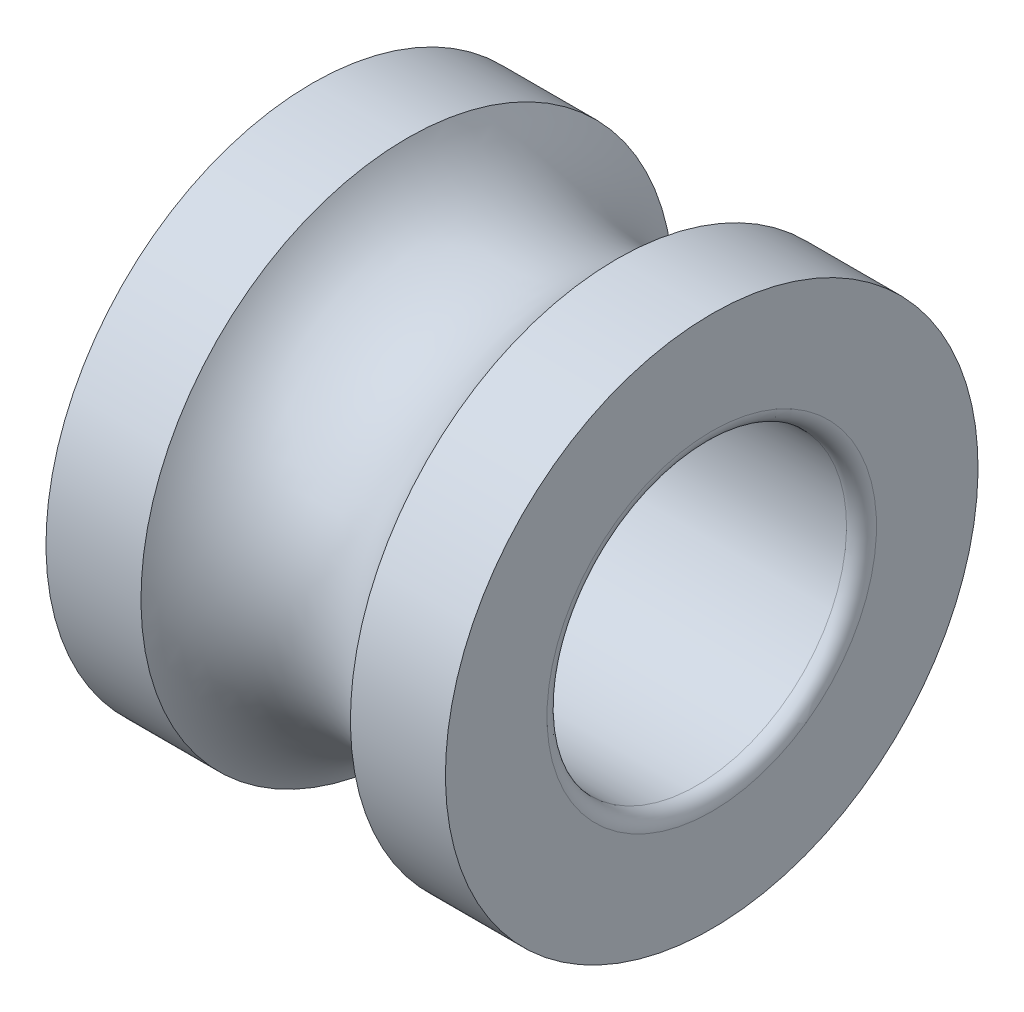
ISO-10303-21;
HEADER;
FILE_DESCRIPTION(('STEP AP214'),'2;1');
FILE_NAME('part.step','',(''),(''),'','','');
FILE_SCHEMA(('AUTOMOTIVE_DESIGN { 1 0 10303 214 1 1 1 1 }'));
ENDSEC;
DATA;
#1=APPLICATION_CONTEXT('core data for automotive mechanical design processes');
#2=APPLICATION_PROTOCOL_DEFINITION('international standard','automotive_design',2000,#1);
#3=PRODUCT_CONTEXT('',#1,'mechanical');
#4=PRODUCT('Part','Part','',(#3));
#5=PRODUCT_RELATED_PRODUCT_CATEGORY('part','',(#4));
#6=PRODUCT_DEFINITION_FORMATION('','',#4);
#7=PRODUCT_DEFINITION_CONTEXT('part definition',#1,'design');
#8=PRODUCT_DEFINITION('design','',#6,#7);
#9=PRODUCT_DEFINITION_SHAPE('','',#8);
#10=(LENGTH_UNIT() NAMED_UNIT(*) SI_UNIT(.MILLI.,.METRE.));
#11=(NAMED_UNIT(*) PLANE_ANGLE_UNIT() SI_UNIT($,.RADIAN.));
#12=(NAMED_UNIT(*) SI_UNIT($,.STERADIAN.) SOLID_ANGLE_UNIT());
#13=UNCERTAINTY_MEASURE_WITH_UNIT(LENGTH_MEASURE(1.E-05),#10,'distance_accuracy_value','');
#14=(GEOMETRIC_REPRESENTATION_CONTEXT(3) GLOBAL_UNCERTAINTY_ASSIGNED_CONTEXT((#13)) GLOBAL_UNIT_ASSIGNED_CONTEXT((#10,
#11,#12)) REPRESENTATION_CONTEXT('',''));
#15=CARTESIAN_POINT('',(0.,0.,0.));
#16=DIRECTION('',(0.,0.,1.));
#17=DIRECTION('',(1.,0.,0.));
#18=AXIS2_PLACEMENT_3D('',#15,#16,#17);
#19=CARTESIAN_POINT('',(-1.85,0.,0.));
#20=DIRECTION('',(1.,0.,0.));
#21=DIRECTION('',(0.,0.,-1.));
#22=AXIS2_PLACEMENT_3D('',#19,#20,#21);
#23=TOROIDAL_SURFACE('',#22,1.65,0.15);
#24=CARTESIAN_POINT('',(-1.85,0.,0.));
#25=DIRECTION('',(1.,0.,0.));
#26=DIRECTION('',(0.,1.,0.));
#27=AXIS2_PLACEMENT_3D('',#24,#25,#26);
#28=CIRCLE('',#27,1.5);
#29=CARTESIAN_POINT('',(-1.85,1.5,0.));
#30=VERTEX_POINT('',#29);
#31=EDGE_CURVE('E10',#30,#30,#28,.T.);
#32=ORIENTED_EDGE('',*,*,#31,.T.);
#33=EDGE_LOOP('',(#32));
#34=FACE_BOUND('',#33,.T.);
#35=CARTESIAN_POINT('',(-2.,0.,0.));
#36=DIRECTION('',(1.,0.,0.));
#37=DIRECTION('',(0.,1.,0.));
#38=AXIS2_PLACEMENT_3D('',#35,#36,#37);
#39=CIRCLE('',#38,1.65);
#40=CARTESIAN_POINT('',(-2.,1.65,0.));
#41=VERTEX_POINT('',#40);
#42=EDGE_CURVE('E45',#41,#41,#39,.T.);
#43=ORIENTED_EDGE('',*,*,#42,.F.);
#44=EDGE_LOOP('',(#43));
#45=FACE_BOUND('',#44,.T.);
#46=ADVANCED_FACE('F15',(#34,#45),#23,.T.);
#47=CARTESIAN_POINT('',(0.,0.,0.));
#48=DIRECTION('',(-1.,0.,0.));
#49=DIRECTION('',(0.,1.,0.));
#50=AXIS2_PLACEMENT_3D('',#47,#48,#49);
#51=CYLINDRICAL_SURFACE('',#50,1.5);
#52=CARTESIAN_POINT('',(1.85,0.,0.));
#53=DIRECTION('',(1.,0.,0.));
#54=DIRECTION('',(0.,1.,0.));
#55=AXIS2_PLACEMENT_3D('',#52,#53,#54);
#56=CIRCLE('',#55,1.5);
#57=CARTESIAN_POINT('',(1.85,1.5,0.));
#58=VERTEX_POINT('',#57);
#59=EDGE_CURVE('E24',#58,#58,#56,.T.);
#60=ORIENTED_EDGE('',*,*,#59,.T.);
#61=EDGE_LOOP('',(#60));
#62=FACE_BOUND('',#61,.T.);
#63=ORIENTED_EDGE('',*,*,#31,.F.);
#64=EDGE_LOOP('',(#63));
#65=FACE_BOUND('',#64,.T.);
#66=ADVANCED_FACE('F63',(#62,#65),#51,.F.);
#67=CARTESIAN_POINT('',(1.85,0.,0.));
#68=DIRECTION('',(1.,0.,0.));
#69=DIRECTION('',(0.,0.,-1.));
#70=AXIS2_PLACEMENT_3D('',#67,#68,#69);
#71=TOROIDAL_SURFACE('',#70,1.65,0.15);
#72=CARTESIAN_POINT('',(2.,0.,0.));
#73=DIRECTION('',(1.,0.,0.));
#74=DIRECTION('',(0.,1.,0.));
#75=AXIS2_PLACEMENT_3D('',#72,#73,#74);
#76=CIRCLE('',#75,1.65);
#77=CARTESIAN_POINT('',(2.,1.65,0.));
#78=VERTEX_POINT('',#77);
#79=EDGE_CURVE('E59',#78,#78,#76,.T.);
#80=ORIENTED_EDGE('',*,*,#79,.T.);
#81=EDGE_LOOP('',(#80));
#82=FACE_BOUND('',#81,.T.);
#83=ORIENTED_EDGE('',*,*,#59,.F.);
#84=EDGE_LOOP('',(#83));
#85=FACE_BOUND('',#84,.T.);
#86=ADVANCED_FACE('F66',(#82,#85),#71,.T.);
#87=CARTESIAN_POINT('',(2.,2.15833333333333,0.));
#88=DIRECTION('',(1.,0.,0.));
#89=DIRECTION('',(0.,1.,0.));
#90=AXIS2_PLACEMENT_3D('',#87,#88,#89);
#91=PLANE('',#90);
#92=CARTESIAN_POINT('',(2.,0.,0.));
#93=DIRECTION('',(1.,0.,0.));
#94=DIRECTION('',(0.,1.,0.));
#95=AXIS2_PLACEMENT_3D('',#92,#93,#94);
#96=CIRCLE('',#95,2.66666666666666);
#97=CARTESIAN_POINT('',(2.,2.66666666666666,0.));
#98=VERTEX_POINT('',#97);
#99=EDGE_CURVE('E56',#98,#98,#96,.T.);
#100=ORIENTED_EDGE('',*,*,#99,.T.);
#101=EDGE_LOOP('',(#100));
#102=FACE_BOUND('',#101,.T.);
#103=ORIENTED_EDGE('',*,*,#79,.F.);
#104=EDGE_LOOP('',(#103));
#105=FACE_BOUND('',#104,.T.);
#106=ADVANCED_FACE('F68',(#102,#105),#91,.T.);
#107=CARTESIAN_POINT('',(1.52433820722464,0.,0.));
#108=DIRECTION('',(-1.,0.,0.));
#109=DIRECTION('',(0.,1.,0.));
#110=AXIS2_PLACEMENT_3D('',#107,#108,#109);
#111=CYLINDRICAL_SURFACE('',#110,2.66666666666666);
#112=CARTESIAN_POINT('',(1.04867641444929,0.,0.));
#113=DIRECTION('',(1.,0.,0.));
#114=DIRECTION('',(0.,1.,0.));
#115=AXIS2_PLACEMENT_3D('',#112,#113,#114);
#116=CIRCLE('',#115,2.66666666666666);
#117=CARTESIAN_POINT('',(1.04867641444929,2.66666666666666,0.));
#118=VERTEX_POINT('',#117);
#119=EDGE_CURVE('E51',#118,#118,#116,.T.);
#120=ORIENTED_EDGE('',*,*,#119,.T.);
#121=EDGE_LOOP('',(#120));
#122=FACE_BOUND('',#121,.T.);
#123=ORIENTED_EDGE('',*,*,#99,.F.);
#124=EDGE_LOOP('',(#123));
#125=FACE_BOUND('',#124,.T.);
#126=ADVANCED_FACE('F76',(#122,#125),#111,.T.);
#127=CARTESIAN_POINT('',(0.,0.,0.));
#128=DIRECTION('',(1.,0.,0.));
#129=DIRECTION('',(0.,0.,-1.));
#130=AXIS2_PLACEMENT_3D('',#127,#128,#129);
#131=TOROIDAL_SURFACE('',#130,3.25,1.2);
#132=CARTESIAN_POINT('',(-1.04867641444929,0.,0.));
#133=DIRECTION('',(1.,0.,0.));
#134=DIRECTION('',(0.,1.,0.));
#135=AXIS2_PLACEMENT_3D('',#132,#133,#134);
#136=CIRCLE('',#135,2.66666666666667);
#137=CARTESIAN_POINT('',(-1.04867641444929,2.66666666666667,0.));
#138=VERTEX_POINT('',#137);
#139=EDGE_CURVE('E49',#138,#138,#136,.T.);
#140=ORIENTED_EDGE('',*,*,#139,.T.);
#141=EDGE_LOOP('',(#140));
#142=FACE_BOUND('',#141,.T.);
#143=ORIENTED_EDGE('',*,*,#119,.F.);
#144=EDGE_LOOP('',(#143));
#145=FACE_BOUND('',#144,.T.);
#146=ADVANCED_FACE('F111',(#142,#145),#131,.F.);
#147=CARTESIAN_POINT('',(-1.52433820722464,0.,0.));
#148=DIRECTION('',(-1.,0.,0.));
#149=DIRECTION('',(0.,1.,0.));
#150=AXIS2_PLACEMENT_3D('',#147,#148,#149);
#151=CYLINDRICAL_SURFACE('',#150,2.66666666666666);
#152=CARTESIAN_POINT('',(-2.,0.,0.));
#153=DIRECTION('',(1.,0.,0.));
#154=DIRECTION('',(0.,1.,0.));
#155=AXIS2_PLACEMENT_3D('',#152,#153,#154);
#156=CIRCLE('',#155,2.66666666666666);
#157=CARTESIAN_POINT('',(-2.,2.66666666666666,0.));
#158=VERTEX_POINT('',#157);
#159=EDGE_CURVE('E18',#158,#158,#156,.T.);
#160=ORIENTED_EDGE('',*,*,#159,.T.);
#161=EDGE_LOOP('',(#160));
#162=FACE_BOUND('',#161,.T.);
#163=ORIENTED_EDGE('',*,*,#139,.F.);
#164=EDGE_LOOP('',(#163));
#165=FACE_BOUND('',#164,.T.);
#166=ADVANCED_FACE('F121',(#162,#165),#151,.T.);
#167=CARTESIAN_POINT('',(-2.,2.15833333333333,0.));
#168=DIRECTION('',(-1.,0.,0.));
#169=DIRECTION('',(0.,-1.,0.));
#170=AXIS2_PLACEMENT_3D('',#167,#168,#169);
#171=PLANE('',#170);
#172=ORIENTED_EDGE('',*,*,#42,.T.);
#173=EDGE_LOOP('',(#172));
#174=FACE_BOUND('',#173,.T.);
#175=ORIENTED_EDGE('',*,*,#159,.F.);
#176=EDGE_LOOP('',(#175));
#177=FACE_BOUND('',#176,.T.);
#178=ADVANCED_FACE('F46',(#174,#177),#171,.T.);
#179=CLOSED_SHELL('',(#46,#66,#86,#106,#126,#146,#166,#178));
#180=MANIFOLD_SOLID_BREP('B1',#179);
#181=ADVANCED_BREP_SHAPE_REPRESENTATION('',(#18,#180),#14);
#182=SHAPE_DEFINITION_REPRESENTATION(#9,#181);
ENDSEC;
END-ISO-10303-21;
